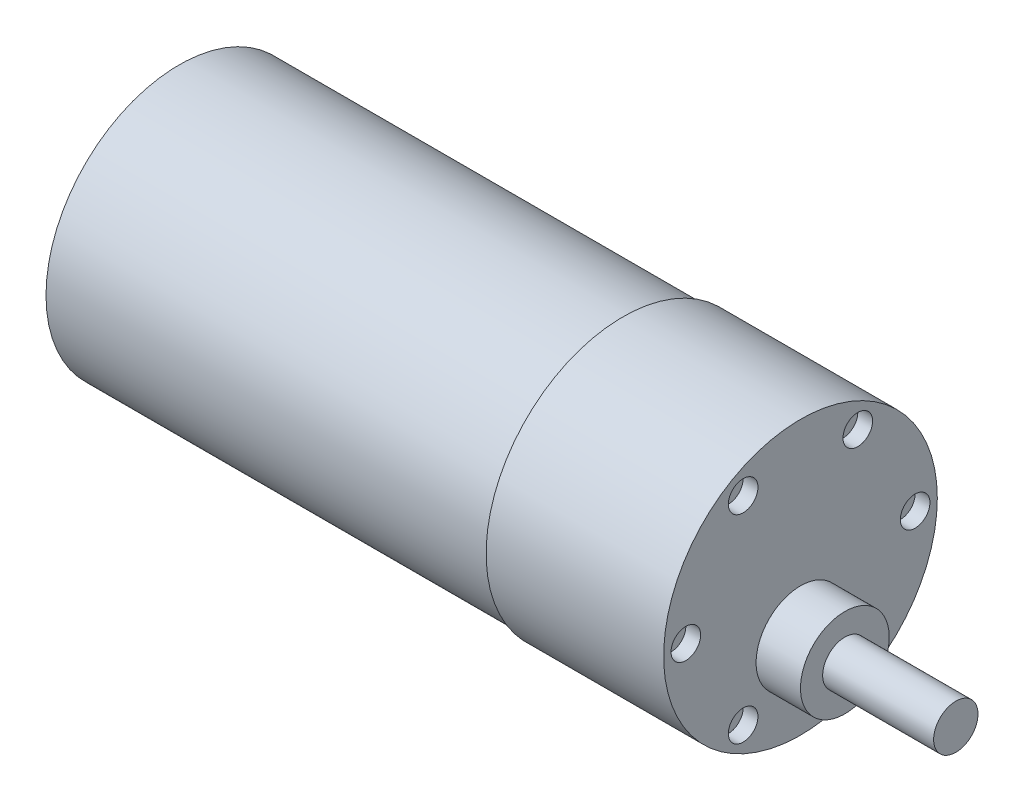
ISO-10303-21;
HEADER;
FILE_DESCRIPTION(('STEP AP214'),'2;1');
FILE_NAME('part.step','',(''),(''),'','','');
FILE_SCHEMA(('AUTOMOTIVE_DESIGN { 1 0 10303 214 1 1 1 1 }'));
ENDSEC;
DATA;
#1=APPLICATION_CONTEXT('core data for automotive mechanical design processes');
#2=APPLICATION_PROTOCOL_DEFINITION('international standard','automotive_design',2000,#1);
#3=PRODUCT_CONTEXT('',#1,'mechanical');
#4=PRODUCT('Part','Part','',(#3));
#5=PRODUCT_RELATED_PRODUCT_CATEGORY('part','',(#4));
#6=PRODUCT_DEFINITION_FORMATION('','',#4);
#7=PRODUCT_DEFINITION_CONTEXT('part definition',#1,'design');
#8=PRODUCT_DEFINITION('design','',#6,#7);
#9=PRODUCT_DEFINITION_SHAPE('','',#8);
#10=(LENGTH_UNIT() NAMED_UNIT(*) SI_UNIT(.MILLI.,.METRE.));
#11=(NAMED_UNIT(*) PLANE_ANGLE_UNIT() SI_UNIT($,.RADIAN.));
#12=(NAMED_UNIT(*) SI_UNIT($,.STERADIAN.) SOLID_ANGLE_UNIT());
#13=UNCERTAINTY_MEASURE_WITH_UNIT(LENGTH_MEASURE(1.E-05),#10,'distance_accuracy_value','');
#14=(GEOMETRIC_REPRESENTATION_CONTEXT(3) GLOBAL_UNCERTAINTY_ASSIGNED_CONTEXT((#13)) GLOBAL_UNIT_ASSIGNED_CONTEXT((#10,
#11,#12)) REPRESENTATION_CONTEXT('',''));
#15=CARTESIAN_POINT('',(0.,0.,0.));
#16=DIRECTION('',(0.,0.,1.));
#17=DIRECTION('',(1.,0.,0.));
#18=AXIS2_PLACEMENT_3D('',#15,#16,#17);
#19=CARTESIAN_POINT('',(-24.,0.,0.));
#20=DIRECTION('',(1.,0.,0.));
#21=DIRECTION('',(0.,0.,-1.));
#22=AXIS2_PLACEMENT_3D('',#19,#20,#21);
#23=CYLINDRICAL_SURFACE('',#22,18.5);
#24=CARTESIAN_POINT('',(-24.,0.,0.));
#25=DIRECTION('',(1.,0.,0.));
#26=DIRECTION('',(0.,0.,-1.));
#27=AXIS2_PLACEMENT_3D('',#24,#25,#26);
#28=CIRCLE('',#27,18.5);
#29=CARTESIAN_POINT('',(-24.,0.,-18.5));
#30=VERTEX_POINT('',#29);
#31=EDGE_CURVE('E44',#30,#30,#28,.T.);
#32=ORIENTED_EDGE('',*,*,#31,.T.);
#33=EDGE_LOOP('',(#32));
#34=FACE_BOUND('',#33,.T.);
#35=CARTESIAN_POINT('',(0.,0.,0.));
#36=DIRECTION('',(1.,0.,0.));
#37=DIRECTION('',(0.,0.,-1.));
#38=AXIS2_PLACEMENT_3D('',#35,#36,#37);
#39=CIRCLE('',#38,18.5);
#40=CARTESIAN_POINT('',(0.,0.,-18.5));
#41=VERTEX_POINT('',#40);
#42=EDGE_CURVE('E35',#41,#41,#39,.T.);
#43=ORIENTED_EDGE('',*,*,#42,.F.);
#44=EDGE_LOOP('',(#43));
#45=FACE_BOUND('',#44,.T.);
#46=ADVANCED_FACE('F32',(#34,#45),#23,.T.);
#47=CARTESIAN_POINT('',(-24.,0.,0.));
#48=DIRECTION('',(1.,0.,0.));
#49=DIRECTION('',(0.,0.,-1.));
#50=AXIS2_PLACEMENT_3D('',#47,#48,#49);
#51=PLANE('',#50);
#52=CARTESIAN_POINT('',(-24.,0.,0.));
#53=DIRECTION('',(-1.,0.,0.));
#54=DIRECTION('',(0.,0.,1.));
#55=AXIS2_PLACEMENT_3D('',#52,#53,#54);
#56=CIRCLE('',#55,18.);
#57=CARTESIAN_POINT('',(-24.,0.,18.));
#58=VERTEX_POINT('',#57);
#59=EDGE_CURVE('E39',#58,#58,#56,.T.);
#60=ORIENTED_EDGE('',*,*,#59,.F.);
#61=EDGE_LOOP('',(#60));
#62=FACE_BOUND('',#61,.T.);
#63=ORIENTED_EDGE('',*,*,#31,.F.);
#64=EDGE_LOOP('',(#63));
#65=FACE_BOUND('',#64,.T.);
#66=ADVANCED_FACE('F67',(#62,#65),#51,.F.);
#67=CARTESIAN_POINT('',(0.,0.,0.));
#68=DIRECTION('',(1.,0.,0.));
#69=DIRECTION('',(0.,0.,-1.));
#70=AXIS2_PLACEMENT_3D('',#67,#68,#69);
#71=PLANE('',#70);
#72=CARTESIAN_POINT('',(0.,0.,15.5));
#73=DIRECTION('',(1.,0.,0.));
#74=DIRECTION('',(0.,0.,-1.));
#75=AXIS2_PLACEMENT_3D('',#72,#73,#74);
#76=CIRCLE('',#75,2.);
#77=CARTESIAN_POINT('',(0.,0.,13.5));
#78=VERTEX_POINT('',#77);
#79=EDGE_CURVE('E156',#78,#78,#76,.T.);
#80=ORIENTED_EDGE('',*,*,#79,.F.);
#81=EDGE_LOOP('',(#80));
#82=FACE_BOUND('',#81,.T.);
#83=CARTESIAN_POINT('',(0.,-13.4233937586587,7.75000000000016));
#84=DIRECTION('',(1.,0.,0.));
#85=DIRECTION('',(0.,0.,-1.));
#86=AXIS2_PLACEMENT_3D('',#83,#84,#85);
#87=CIRCLE('',#86,2.);
#88=CARTESIAN_POINT('',(0.,-13.4233937586587,5.75000000000016));
#89=VERTEX_POINT('',#88);
#90=EDGE_CURVE('E167',#89,#89,#87,.T.);
#91=ORIENTED_EDGE('',*,*,#90,.F.);
#92=EDGE_LOOP('',(#91));
#93=FACE_BOUND('',#92,.T.);
#94=CARTESIAN_POINT('',(0.,-13.4233937586589,-7.74999999999987));
#95=DIRECTION('',(1.,0.,0.));
#96=DIRECTION('',(0.,0.,-1.));
#97=AXIS2_PLACEMENT_3D('',#94,#95,#96);
#98=CIRCLE('',#97,2.);
#99=CARTESIAN_POINT('',(0.,-13.4233937586589,-9.74999999999987));
#100=VERTEX_POINT('',#99);
#101=EDGE_CURVE('E166',#100,#100,#98,.T.);
#102=ORIENTED_EDGE('',*,*,#101,.F.);
#103=EDGE_LOOP('',(#102));
#104=FACE_BOUND('',#103,.T.);
#105=CARTESIAN_POINT('',(0.,-1.08235921504137E-13,-15.5));
#106=DIRECTION('',(1.,0.,0.));
#107=DIRECTION('',(0.,0.,-1.));
#108=AXIS2_PLACEMENT_3D('',#105,#106,#107);
#109=CIRCLE('',#108,2.);
#110=CARTESIAN_POINT('',(0.,-1.08235921504137E-13,-17.5));
#111=VERTEX_POINT('',#110);
#112=EDGE_CURVE('E184',#111,#111,#109,.T.);
#113=ORIENTED_EDGE('',*,*,#112,.F.);
#114=EDGE_LOOP('',(#113));
#115=FACE_BOUND('',#114,.T.);
#116=CARTESIAN_POINT('',(0.,13.4233937586588,-7.75000000000006));
#117=DIRECTION('',(1.,0.,0.));
#118=DIRECTION('',(0.,0.,-1.));
#119=AXIS2_PLACEMENT_3D('',#116,#117,#118);
#120=CIRCLE('',#119,2.);
#121=CARTESIAN_POINT('',(0.,13.4233937586588,-9.75000000000006));
#122=VERTEX_POINT('',#121);
#123=EDGE_CURVE('E178',#122,#122,#120,.T.);
#124=ORIENTED_EDGE('',*,*,#123,.F.);
#125=EDGE_LOOP('',(#124));
#126=FACE_BOUND('',#125,.T.);
#127=CARTESIAN_POINT('',(0.,13.4233937586588,7.74999999999997));
#128=DIRECTION('',(1.,0.,0.));
#129=DIRECTION('',(0.,0.,-1.));
#130=AXIS2_PLACEMENT_3D('',#127,#128,#129);
#131=CIRCLE('',#130,2.);
#132=CARTESIAN_POINT('',(0.,13.4233937586588,5.74999999999997));
#133=VERTEX_POINT('',#132);
#134=EDGE_CURVE('E172',#133,#133,#131,.T.);
#135=ORIENTED_EDGE('',*,*,#134,.F.);
#136=EDGE_LOOP('',(#135));
#137=FACE_BOUND('',#136,.T.);
#138=CARTESIAN_POINT('',(0.,-7.,0.));
#139=DIRECTION('',(1.,0.,0.));
#140=DIRECTION('',(0.,0.,-1.));
#141=AXIS2_PLACEMENT_3D('',#138,#139,#140);
#142=CIRCLE('',#141,6.);
#143=CARTESIAN_POINT('',(0.,-7.,-6.));
#144=VERTEX_POINT('',#143);
#145=EDGE_CURVE('E54',#144,#144,#142,.T.);
#146=ORIENTED_EDGE('',*,*,#145,.F.);
#147=EDGE_LOOP('',(#146));
#148=FACE_BOUND('',#147,.T.);
#149=ORIENTED_EDGE('',*,*,#42,.T.);
#150=EDGE_LOOP('',(#149));
#151=FACE_BOUND('',#150,.T.);
#152=ADVANCED_FACE('F64',(#82,#93,#104,#115,#126,#137,#148,#151),#71,.T.);
#153=CARTESIAN_POINT('',(-84.,0.,0.));
#154=DIRECTION('',(1.,0.,0.));
#155=DIRECTION('',(0.,0.,-1.));
#156=AXIS2_PLACEMENT_3D('',#153,#154,#155);
#157=CYLINDRICAL_SURFACE('',#156,18.);
#158=CARTESIAN_POINT('',(-84.,0.,0.));
#159=DIRECTION('',(-1.,0.,0.));
#160=DIRECTION('',(0.,0.,1.));
#161=AXIS2_PLACEMENT_3D('',#158,#159,#160);
#162=CIRCLE('',#161,18.);
#163=CARTESIAN_POINT('',(-84.,0.,18.));
#164=VERTEX_POINT('',#163);
#165=EDGE_CURVE('E53',#164,#164,#162,.T.);
#166=ORIENTED_EDGE('',*,*,#165,.F.);
#167=EDGE_LOOP('',(#166));
#168=FACE_BOUND('',#167,.T.);
#169=ORIENTED_EDGE('',*,*,#59,.T.);
#170=EDGE_LOOP('',(#169));
#171=FACE_BOUND('',#170,.T.);
#172=ADVANCED_FACE('F76',(#168,#171),#157,.T.);
#173=CARTESIAN_POINT('',(-84.,0.,0.));
#174=DIRECTION('',(-1.,0.,0.));
#175=DIRECTION('',(0.,0.,1.));
#176=AXIS2_PLACEMENT_3D('',#173,#174,#175);
#177=PLANE('',#176);
#178=ORIENTED_EDGE('',*,*,#165,.T.);
#179=EDGE_LOOP('',(#178));
#180=FACE_BOUND('',#179,.T.);
#181=ADVANCED_FACE('F83',(#180),#177,.T.);
#182=CARTESIAN_POINT('',(6.,-7.,0.));
#183=DIRECTION('',(-1.,0.,0.));
#184=DIRECTION('',(0.,0.,1.));
#185=AXIS2_PLACEMENT_3D('',#182,#183,#184);
#186=CYLINDRICAL_SURFACE('',#185,6.);
#187=CARTESIAN_POINT('',(6.,-7.,0.));
#188=DIRECTION('',(1.,0.,0.));
#189=DIRECTION('',(0.,0.,-1.));
#190=AXIS2_PLACEMENT_3D('',#187,#188,#189);
#191=CIRCLE('',#190,6.);
#192=CARTESIAN_POINT('',(6.,-7.,-6.));
#193=VERTEX_POINT('',#192);
#194=EDGE_CURVE('E50',#193,#193,#191,.T.);
#195=ORIENTED_EDGE('',*,*,#194,.F.);
#196=EDGE_LOOP('',(#195));
#197=FACE_BOUND('',#196,.T.);
#198=ORIENTED_EDGE('',*,*,#145,.T.);
#199=EDGE_LOOP('',(#198));
#200=FACE_BOUND('',#199,.T.);
#201=ADVANCED_FACE('F87',(#197,#200),#186,.T.);
#202=CARTESIAN_POINT('',(6.,-7.,0.));
#203=DIRECTION('',(1.,0.,0.));
#204=DIRECTION('',(0.,0.,-1.));
#205=AXIS2_PLACEMENT_3D('',#202,#203,#204);
#206=PLANE('',#205);
#207=CARTESIAN_POINT('',(6.,-7.,0.));
#208=DIRECTION('',(1.,0.,0.));
#209=DIRECTION('',(0.,0.,-1.));
#210=AXIS2_PLACEMENT_3D('',#207,#208,#209);
#211=CIRCLE('',#210,3.);
#212=CARTESIAN_POINT('',(6.,-7.,-3.));
#213=VERTEX_POINT('',#212);
#214=EDGE_CURVE('E10',#213,#213,#211,.T.);
#215=ORIENTED_EDGE('',*,*,#214,.F.);
#216=EDGE_LOOP('',(#215));
#217=FACE_BOUND('',#216,.T.);
#218=ORIENTED_EDGE('',*,*,#194,.T.);
#219=EDGE_LOOP('',(#218));
#220=FACE_BOUND('',#219,.T.);
#221=ADVANCED_FACE('F91',(#217,#220),#206,.T.);
#222=CARTESIAN_POINT('',(21.,-7.,0.));
#223=DIRECTION('',(-1.,0.,0.));
#224=DIRECTION('',(0.,0.,1.));
#225=AXIS2_PLACEMENT_3D('',#222,#223,#224);
#226=CYLINDRICAL_SURFACE('',#225,3.);
#227=CARTESIAN_POINT('',(21.,-7.,0.));
#228=DIRECTION('',(1.,0.,0.));
#229=DIRECTION('',(0.,0.,-1.));
#230=AXIS2_PLACEMENT_3D('',#227,#228,#229);
#231=CIRCLE('',#230,3.);
#232=CARTESIAN_POINT('',(21.,-7.,-3.));
#233=VERTEX_POINT('',#232);
#234=EDGE_CURVE('E48',#233,#233,#231,.T.);
#235=ORIENTED_EDGE('',*,*,#234,.F.);
#236=EDGE_LOOP('',(#235));
#237=FACE_BOUND('',#236,.T.);
#238=ORIENTED_EDGE('',*,*,#214,.T.);
#239=EDGE_LOOP('',(#238));
#240=FACE_BOUND('',#239,.T.);
#241=ADVANCED_FACE('F95',(#237,#240),#226,.T.);
#242=CARTESIAN_POINT('',(21.,-7.,0.));
#243=DIRECTION('',(1.,0.,0.));
#244=DIRECTION('',(0.,0.,-1.));
#245=AXIS2_PLACEMENT_3D('',#242,#243,#244);
#246=PLANE('',#245);
#247=ORIENTED_EDGE('',*,*,#234,.T.);
#248=EDGE_LOOP('',(#247));
#249=FACE_BOUND('',#248,.T.);
#250=ADVANCED_FACE('F99',(#249),#246,.T.);
#251=CARTESIAN_POINT('',(-2.,13.4233937586588,7.74999999999997));
#252=DIRECTION('',(1.,0.,0.));
#253=DIRECTION('',(0.,0.,-1.));
#254=AXIS2_PLACEMENT_3D('',#251,#252,#253);
#255=CYLINDRICAL_SURFACE('',#254,2.);
#256=CARTESIAN_POINT('',(-2.,13.4233937586588,7.74999999999997));
#257=DIRECTION('',(1.,0.,0.));
#258=DIRECTION('',(0.,0.,-1.));
#259=AXIS2_PLACEMENT_3D('',#256,#257,#258);
#260=CIRCLE('',#259,2.);
#261=CARTESIAN_POINT('',(-2.,13.4233937586588,5.74999999999997));
#262=VERTEX_POINT('',#261);
#263=EDGE_CURVE('E160',#262,#262,#260,.T.);
#264=ORIENTED_EDGE('',*,*,#263,.F.);
#265=EDGE_LOOP('',(#264));
#266=FACE_BOUND('',#265,.T.);
#267=ORIENTED_EDGE('',*,*,#134,.T.);
#268=EDGE_LOOP('',(#267));
#269=FACE_BOUND('',#268,.T.);
#270=ADVANCED_FACE('F103',(#266,#269),#255,.F.);
#271=CARTESIAN_POINT('',(-2.,13.4233937586588,7.74999999999997));
#272=DIRECTION('',(1.,0.,0.));
#273=DIRECTION('',(0.,0.,-1.));
#274=AXIS2_PLACEMENT_3D('',#271,#272,#273);
#275=PLANE('',#274);
#276=ORIENTED_EDGE('',*,*,#263,.T.);
#277=EDGE_LOOP('',(#276));
#278=FACE_BOUND('',#277,.T.);
#279=ADVANCED_FACE('F126',(#278),#275,.T.);
#280=CARTESIAN_POINT('',(-2.,13.4233937586588,-7.75000000000006));
#281=DIRECTION('',(1.,0.,0.));
#282=DIRECTION('',(0.,0.,-1.));
#283=AXIS2_PLACEMENT_3D('',#280,#281,#282);
#284=CYLINDRICAL_SURFACE('',#283,2.);
#285=CARTESIAN_POINT('',(-2.,13.4233937586588,-7.75000000000006));
#286=DIRECTION('',(1.,0.,0.));
#287=DIRECTION('',(0.,0.,-1.));
#288=AXIS2_PLACEMENT_3D('',#285,#286,#287);
#289=CIRCLE('',#288,2.);
#290=CARTESIAN_POINT('',(-2.,13.4233937586588,-9.75000000000006));
#291=VERTEX_POINT('',#290);
#292=EDGE_CURVE('E175',#291,#291,#289,.T.);
#293=ORIENTED_EDGE('',*,*,#292,.F.);
#294=EDGE_LOOP('',(#293));
#295=FACE_BOUND('',#294,.T.);
#296=ORIENTED_EDGE('',*,*,#123,.T.);
#297=EDGE_LOOP('',(#296));
#298=FACE_BOUND('',#297,.T.);
#299=ADVANCED_FACE('F123',(#295,#298),#284,.F.);
#300=CARTESIAN_POINT('',(-2.,13.4233937586588,-7.75000000000006));
#301=DIRECTION('',(1.,0.,0.));
#302=DIRECTION('',(0.,0.,-1.));
#303=AXIS2_PLACEMENT_3D('',#300,#301,#302);
#304=PLANE('',#303);
#305=ORIENTED_EDGE('',*,*,#292,.T.);
#306=EDGE_LOOP('',(#305));
#307=FACE_BOUND('',#306,.T.);
#308=ADVANCED_FACE('F118',(#307),#304,.T.);
#309=CARTESIAN_POINT('',(-2.,-1.08235921504137E-13,-15.5));
#310=DIRECTION('',(1.,0.,0.));
#311=DIRECTION('',(0.,0.,-1.));
#312=AXIS2_PLACEMENT_3D('',#309,#310,#311);
#313=CYLINDRICAL_SURFACE('',#312,2.);
#314=CARTESIAN_POINT('',(-2.,-1.08235921504137E-13,-15.5));
#315=DIRECTION('',(1.,0.,0.));
#316=DIRECTION('',(0.,0.,-1.));
#317=AXIS2_PLACEMENT_3D('',#314,#315,#316);
#318=CIRCLE('',#317,2.);
#319=CARTESIAN_POINT('',(-2.,-1.08235921504137E-13,-17.5));
#320=VERTEX_POINT('',#319);
#321=EDGE_CURVE('E181',#320,#320,#318,.T.);
#322=ORIENTED_EDGE('',*,*,#321,.F.);
#323=EDGE_LOOP('',(#322));
#324=FACE_BOUND('',#323,.T.);
#325=ORIENTED_EDGE('',*,*,#112,.T.);
#326=EDGE_LOOP('',(#325));
#327=FACE_BOUND('',#326,.T.);
#328=ADVANCED_FACE('F115',(#324,#327),#313,.F.);
#329=CARTESIAN_POINT('',(-2.,-1.08235921504137E-13,-15.5));
#330=DIRECTION('',(1.,0.,0.));
#331=DIRECTION('',(0.,0.,-1.));
#332=AXIS2_PLACEMENT_3D('',#329,#330,#331);
#333=PLANE('',#332);
#334=ORIENTED_EDGE('',*,*,#321,.T.);
#335=EDGE_LOOP('',(#334));
#336=FACE_BOUND('',#335,.T.);
#337=ADVANCED_FACE('F109',(#336),#333,.T.);
#338=CARTESIAN_POINT('',(-2.,-13.4233937586589,-7.74999999999987));
#339=DIRECTION('',(1.,0.,0.));
#340=DIRECTION('',(0.,0.,-1.));
#341=AXIS2_PLACEMENT_3D('',#338,#339,#340);
#342=CYLINDRICAL_SURFACE('',#341,2.);
#343=CARTESIAN_POINT('',(-2.,-13.4233937586589,-7.74999999999987));
#344=DIRECTION('',(1.,0.,0.));
#345=DIRECTION('',(0.,0.,-1.));
#346=AXIS2_PLACEMENT_3D('',#343,#344,#345);
#347=CIRCLE('',#346,2.);
#348=CARTESIAN_POINT('',(-2.,-13.4233937586589,-9.74999999999987));
#349=VERTEX_POINT('',#348);
#350=EDGE_CURVE('E187',#349,#349,#347,.T.);
#351=ORIENTED_EDGE('',*,*,#350,.F.);
#352=EDGE_LOOP('',(#351));
#353=FACE_BOUND('',#352,.T.);
#354=ORIENTED_EDGE('',*,*,#101,.T.);
#355=EDGE_LOOP('',(#354));
#356=FACE_BOUND('',#355,.T.);
#357=ADVANCED_FACE('F105',(#353,#356),#342,.F.);
#358=CARTESIAN_POINT('',(-2.,-13.4233937586589,-7.74999999999987));
#359=DIRECTION('',(1.,0.,0.));
#360=DIRECTION('',(0.,0.,-1.));
#361=AXIS2_PLACEMENT_3D('',#358,#359,#360);
#362=PLANE('',#361);
#363=ORIENTED_EDGE('',*,*,#350,.T.);
#364=EDGE_LOOP('',(#363));
#365=FACE_BOUND('',#364,.T.);
#366=ADVANCED_FACE('F108',(#365),#362,.T.);
#367=CARTESIAN_POINT('',(-2.,-13.4233937586587,7.75000000000016));
#368=DIRECTION('',(1.,0.,0.));
#369=DIRECTION('',(0.,0.,-1.));
#370=AXIS2_PLACEMENT_3D('',#367,#368,#369);
#371=CYLINDRICAL_SURFACE('',#370,2.);
#372=CARTESIAN_POINT('',(-2.,-13.4233937586587,7.75000000000016));
#373=DIRECTION('',(1.,0.,0.));
#374=DIRECTION('',(0.,0.,-1.));
#375=AXIS2_PLACEMENT_3D('',#372,#373,#374);
#376=CIRCLE('',#375,2.);
#377=CARTESIAN_POINT('',(-2.,-13.4233937586587,5.75000000000016));
#378=VERTEX_POINT('',#377);
#379=EDGE_CURVE('E163',#378,#378,#376,.T.);
#380=ORIENTED_EDGE('',*,*,#379,.F.);
#381=EDGE_LOOP('',(#380));
#382=FACE_BOUND('',#381,.T.);
#383=ORIENTED_EDGE('',*,*,#90,.T.);
#384=EDGE_LOOP('',(#383));
#385=FACE_BOUND('',#384,.T.);
#386=ADVANCED_FACE('F113',(#382,#385),#371,.F.);
#387=CARTESIAN_POINT('',(-2.,-13.4233937586587,7.75000000000016));
#388=DIRECTION('',(1.,0.,0.));
#389=DIRECTION('',(0.,0.,-1.));
#390=AXIS2_PLACEMENT_3D('',#387,#388,#389);
#391=PLANE('',#390);
#392=ORIENTED_EDGE('',*,*,#379,.T.);
#393=EDGE_LOOP('',(#392));
#394=FACE_BOUND('',#393,.T.);
#395=ADVANCED_FACE('F139',(#394),#391,.T.);
#396=CARTESIAN_POINT('',(-2.,0.,15.5));
#397=DIRECTION('',(1.,0.,0.));
#398=DIRECTION('',(0.,0.,-1.));
#399=AXIS2_PLACEMENT_3D('',#396,#397,#398);
#400=CYLINDRICAL_SURFACE('',#399,2.);
#401=CARTESIAN_POINT('',(-2.,0.,15.5));
#402=DIRECTION('',(1.,0.,0.));
#403=DIRECTION('',(0.,0.,-1.));
#404=AXIS2_PLACEMENT_3D('',#401,#402,#403);
#405=CIRCLE('',#404,2.);
#406=CARTESIAN_POINT('',(-2.,0.,13.5));
#407=VERTEX_POINT('',#406);
#408=EDGE_CURVE('E155',#407,#407,#405,.T.);
#409=ORIENTED_EDGE('',*,*,#408,.F.);
#410=EDGE_LOOP('',(#409));
#411=FACE_BOUND('',#410,.T.);
#412=ORIENTED_EDGE('',*,*,#79,.T.);
#413=EDGE_LOOP('',(#412));
#414=FACE_BOUND('',#413,.T.);
#415=ADVANCED_FACE('F143',(#411,#414),#400,.F.);
#416=CARTESIAN_POINT('',(-2.,0.,15.5));
#417=DIRECTION('',(1.,0.,0.));
#418=DIRECTION('',(0.,0.,-1.));
#419=AXIS2_PLACEMENT_3D('',#416,#417,#418);
#420=PLANE('',#419);
#421=ORIENTED_EDGE('',*,*,#408,.T.);
#422=EDGE_LOOP('',(#421));
#423=FACE_BOUND('',#422,.T.);
#424=ADVANCED_FACE('F147',(#423),#420,.T.);
#425=CLOSED_SHELL('',(#46,#66,#152,#172,#181,#201,#221,#241,#250,#270,#279,#299,#308,#328,#337,
#357,#366,#386,#395,#415,#424));
#426=MANIFOLD_SOLID_BREP('B2',#425);
#427=ADVANCED_BREP_SHAPE_REPRESENTATION('',(#18,#426),#14);
#428=SHAPE_DEFINITION_REPRESENTATION(#9,#427);
ENDSEC;
END-ISO-10303-21;
